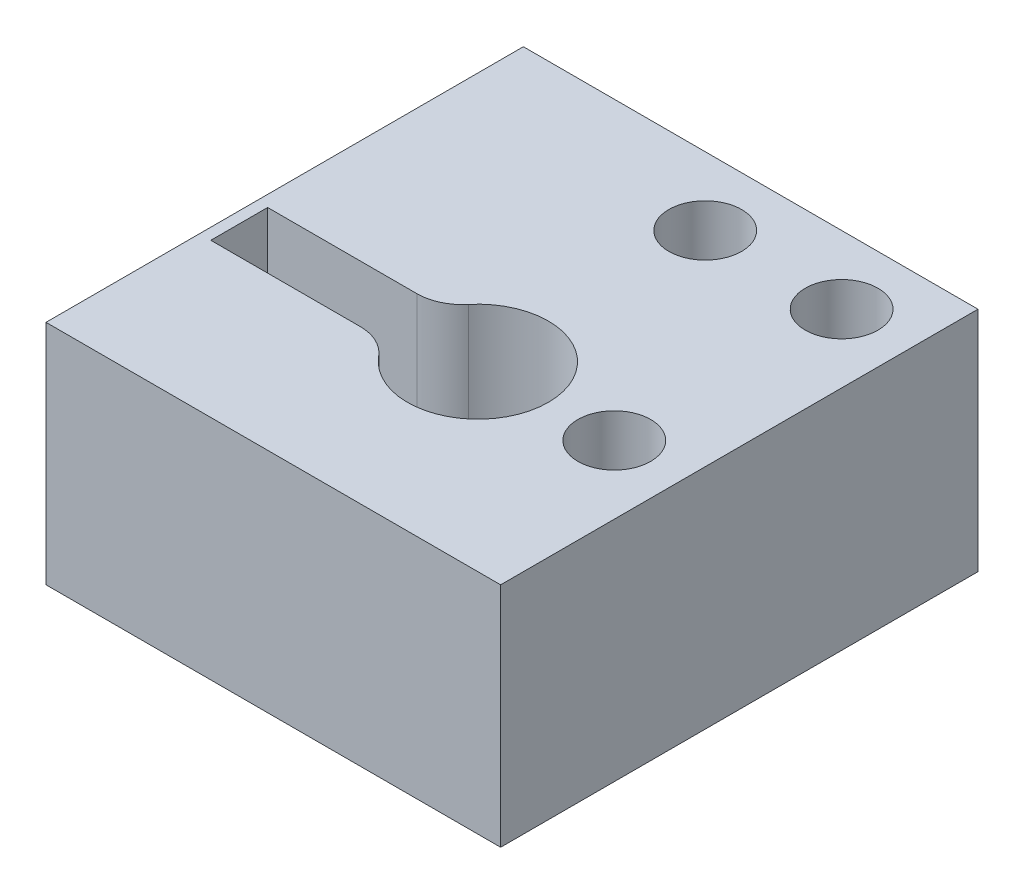
ISO-10303-21;
HEADER;
FILE_DESCRIPTION(('STEP AP214'),'2;1');
FILE_NAME('part.step','',(''),(''),'','','');
FILE_SCHEMA(('AUTOMOTIVE_DESIGN { 1 0 10303 214 1 1 1 1 }'));
ENDSEC;
DATA;
#1=APPLICATION_CONTEXT('core data for automotive mechanical design processes');
#2=APPLICATION_PROTOCOL_DEFINITION('international standard','automotive_design',2000,#1);
#3=PRODUCT_CONTEXT('',#1,'mechanical');
#4=PRODUCT('Part','Part','',(#3));
#5=PRODUCT_RELATED_PRODUCT_CATEGORY('part','',(#4));
#6=PRODUCT_DEFINITION_FORMATION('','',#4);
#7=PRODUCT_DEFINITION_CONTEXT('part definition',#1,'design');
#8=PRODUCT_DEFINITION('design','',#6,#7);
#9=PRODUCT_DEFINITION_SHAPE('','',#8);
#10=(LENGTH_UNIT() NAMED_UNIT(*) SI_UNIT(.MILLI.,.METRE.));
#11=(NAMED_UNIT(*) PLANE_ANGLE_UNIT() SI_UNIT($,.RADIAN.));
#12=(NAMED_UNIT(*) SI_UNIT($,.STERADIAN.) SOLID_ANGLE_UNIT());
#13=UNCERTAINTY_MEASURE_WITH_UNIT(LENGTH_MEASURE(1.E-05),#10,'distance_accuracy_value','');
#14=(GEOMETRIC_REPRESENTATION_CONTEXT(3) GLOBAL_UNCERTAINTY_ASSIGNED_CONTEXT((#13)) GLOBAL_UNIT_ASSIGNED_CONTEXT((#10,
#11,#12)) REPRESENTATION_CONTEXT('',''));
#15=CARTESIAN_POINT('',(0.,0.,0.));
#16=DIRECTION('',(0.,0.,1.));
#17=DIRECTION('',(1.,0.,0.));
#18=AXIS2_PLACEMENT_3D('',#15,#16,#17);
#19=CARTESIAN_POINT('',(10.,10.,10.5));
#20=DIRECTION('',(-1.,0.,0.));
#21=DIRECTION('',(0.,0.,1.));
#22=AXIS2_PLACEMENT_3D('',#19,#20,#21);
#23=PLANE('',#22);
#24=DIRECTION('',(0.,0.,-1.));
#25=VECTOR('',#24,1.);
#26=CARTESIAN_POINT('',(10.,0.,10.5));
#27=LINE('',#26,#25);
#28=CARTESIAN_POINT('',(10.,0.,10.5));
#29=VERTEX_POINT('',#28);
#30=CARTESIAN_POINT('',(10.,0.,-10.5));
#31=VERTEX_POINT('',#30);
#32=EDGE_CURVE('E191',#29,#31,#27,.T.);
#33=ORIENTED_EDGE('',*,*,#32,.T.);
#34=DIRECTION('',(0.,-1.,0.));
#35=VECTOR('',#34,1.);
#36=CARTESIAN_POINT('',(10.,10.,-10.5));
#37=LINE('',#36,#35);
#38=CARTESIAN_POINT('',(10.,10.,-10.5));
#39=VERTEX_POINT('',#38);
#40=EDGE_CURVE('E232',#39,#31,#37,.T.);
#41=ORIENTED_EDGE('',*,*,#40,.F.);
#42=DIRECTION('',(0.,0.,-1.));
#43=VECTOR('',#42,1.);
#44=CARTESIAN_POINT('',(10.,10.,10.5));
#45=LINE('',#44,#43);
#46=CARTESIAN_POINT('',(10.,10.,10.5));
#47=VERTEX_POINT('',#46);
#48=EDGE_CURVE('E197',#47,#39,#45,.T.);
#49=ORIENTED_EDGE('',*,*,#48,.F.);
#50=DIRECTION('',(0.,-1.,0.));
#51=VECTOR('',#50,1.);
#52=CARTESIAN_POINT('',(10.,10.,10.5));
#53=LINE('',#52,#51);
#54=EDGE_CURVE('E211',#47,#29,#53,.T.);
#55=ORIENTED_EDGE('',*,*,#54,.T.);
#56=EDGE_LOOP('',(#33,#41,#49,#55));
#57=FACE_BOUND('',#56,.T.);
#58=ADVANCED_FACE('F47',(#57),#23,.F.);
#59=CARTESIAN_POINT('',(-10.,10.,-10.5));
#60=DIRECTION('',(0.,0.,1.));
#61=DIRECTION('',(1.,0.,0.));
#62=AXIS2_PLACEMENT_3D('',#59,#60,#61);
#63=PLANE('',#62);
#64=DIRECTION('',(-1.,0.,0.));
#65=VECTOR('',#64,1.);
#66=CARTESIAN_POINT('',(-10.,0.,-10.5));
#67=LINE('',#66,#65);
#68=CARTESIAN_POINT('',(-10.,0.,-10.5));
#69=VERTEX_POINT('',#68);
#70=EDGE_CURVE('E215',#31,#69,#67,.T.);
#71=ORIENTED_EDGE('',*,*,#70,.T.);
#72=DIRECTION('',(0.,-1.,0.));
#73=VECTOR('',#72,1.);
#74=CARTESIAN_POINT('',(-10.,10.,-10.5));
#75=LINE('',#74,#73);
#76=CARTESIAN_POINT('',(-10.,10.,-10.5));
#77=VERTEX_POINT('',#76);
#78=EDGE_CURVE('E228',#77,#69,#75,.T.);
#79=ORIENTED_EDGE('',*,*,#78,.F.);
#80=DIRECTION('',(-1.,0.,0.));
#81=VECTOR('',#80,1.);
#82=CARTESIAN_POINT('',(-10.,10.,-10.5));
#83=LINE('',#82,#81);
#84=EDGE_CURVE('E201',#39,#77,#83,.T.);
#85=ORIENTED_EDGE('',*,*,#84,.F.);
#86=ORIENTED_EDGE('',*,*,#40,.T.);
#87=EDGE_LOOP('',(#71,#79,#85,#86));
#88=FACE_BOUND('',#87,.T.);
#89=ADVANCED_FACE('F278',(#88),#63,.F.);
#90=CARTESIAN_POINT('',(-10.,10.,10.5));
#91=DIRECTION('',(1.,0.,0.));
#92=DIRECTION('',(0.,0.,-1.));
#93=AXIS2_PLACEMENT_3D('',#90,#91,#92);
#94=PLANE('',#93);
#95=DIRECTION('',(0.,0.,1.));
#96=VECTOR('',#95,1.);
#97=CARTESIAN_POINT('',(-10.,0.,10.5));
#98=LINE('',#97,#96);
#99=CARTESIAN_POINT('',(-10.,0.,10.5));
#100=VERTEX_POINT('',#99);
#101=EDGE_CURVE('E218',#69,#100,#98,.T.);
#102=ORIENTED_EDGE('',*,*,#101,.T.);
#103=DIRECTION('',(0.,-1.,0.));
#104=VECTOR('',#103,1.);
#105=CARTESIAN_POINT('',(-10.,10.,10.5));
#106=LINE('',#105,#104);
#107=CARTESIAN_POINT('',(-10.,10.,10.5));
#108=VERTEX_POINT('',#107);
#109=EDGE_CURVE('E224',#108,#100,#106,.T.);
#110=ORIENTED_EDGE('',*,*,#109,.F.);
#111=DIRECTION('',(0.,0.,1.));
#112=VECTOR('',#111,1.);
#113=CARTESIAN_POINT('',(-10.,10.,10.5));
#114=LINE('',#113,#112);
#115=EDGE_CURVE('E205',#77,#108,#114,.T.);
#116=ORIENTED_EDGE('',*,*,#115,.F.);
#117=ORIENTED_EDGE('',*,*,#78,.T.);
#118=EDGE_LOOP('',(#102,#110,#116,#117));
#119=FACE_BOUND('',#118,.T.);
#120=ADVANCED_FACE('F283',(#119),#94,.F.);
#121=CARTESIAN_POINT('',(-10.,10.,10.5));
#122=DIRECTION('',(0.,0.,-1.));
#123=DIRECTION('',(-1.,0.,0.));
#124=AXIS2_PLACEMENT_3D('',#121,#122,#123);
#125=PLANE('',#124);
#126=DIRECTION('',(1.,0.,0.));
#127=VECTOR('',#126,1.);
#128=CARTESIAN_POINT('',(-10.,0.,10.5));
#129=LINE('',#128,#127);
#130=EDGE_CURVE('E202',#100,#29,#129,.T.);
#131=ORIENTED_EDGE('',*,*,#130,.T.);
#132=ORIENTED_EDGE('',*,*,#54,.F.);
#133=DIRECTION('',(1.,0.,0.));
#134=VECTOR('',#133,1.);
#135=CARTESIAN_POINT('',(-10.,10.,10.5));
#136=LINE('',#135,#134);
#137=EDGE_CURVE('E208',#108,#47,#136,.T.);
#138=ORIENTED_EDGE('',*,*,#137,.F.);
#139=ORIENTED_EDGE('',*,*,#109,.T.);
#140=EDGE_LOOP('',(#131,#132,#138,#139));
#141=FACE_BOUND('',#140,.T.);
#142=ADVANCED_FACE('F289',(#141),#125,.F.);
#143=CARTESIAN_POINT('',(0.,10.,0.));
#144=DIRECTION('',(0.,-1.,0.));
#145=DIRECTION('',(0.,0.,-1.));
#146=AXIS2_PLACEMENT_3D('',#143,#144,#145);
#147=PLANE('',#146);
#148=DIRECTION('',(1.,0.,0.));
#149=VECTOR('',#148,1.);
#150=CARTESIAN_POINT('',(-1.83681159050086,10.,3.75));
#151=LINE('',#150,#149);
#152=CARTESIAN_POINT('',(-9.5,10.,3.75));
#153=VERTEX_POINT('',#152);
#154=CARTESIAN_POINT('',(-2.93033077488397,10.,3.75));
#155=VERTEX_POINT('',#154);
#156=EDGE_CURVE('E126',#153,#155,#151,.T.);
#157=ORIENTED_EDGE('',*,*,#156,.F.);
#158=DIRECTION('',(0.,0.,-1.));
#159=VECTOR('',#158,1.);
#160=CARTESIAN_POINT('',(-9.5,10.,1.25));
#161=LINE('',#160,#159);
#162=CARTESIAN_POINT('',(-9.5,10.,1.25));
#163=VERTEX_POINT('',#162);
#164=EDGE_CURVE('E130',#153,#163,#161,.T.);
#165=ORIENTED_EDGE('',*,*,#164,.T.);
#166=DIRECTION('',(-1.,0.,0.));
#167=VECTOR('',#166,1.);
#168=CARTESIAN_POINT('',(-1.83681159050086,10.,1.25));
#169=LINE('',#168,#167);
#170=CARTESIAN_POINT('',(-2.93033077488397,10.,1.25));
#171=VERTEX_POINT('',#170);
#172=EDGE_CURVE('E70',#171,#163,#169,.T.);
#173=ORIENTED_EDGE('',*,*,#172,.F.);
#174=CARTESIAN_POINT('',(-2.93033077488397,10.,-0.75));
#175=DIRECTION('',(0.,-1.,0.));
#176=DIRECTION('',(0.,0.,-1.));
#177=AXIS2_PLACEMENT_3D('',#174,#175,#176);
#178=CIRCLE('',#177,2.);
#179=CARTESIAN_POINT('',(-1.38902458865496,10.,0.524509803921568));
#180=VERTEX_POINT('',#179);
#181=EDGE_CURVE('E243',#171,#180,#178,.F.);
#182=ORIENTED_EDGE('',*,*,#181,.T.);
#183=CARTESIAN_POINT('',(0.999999999999999,10.,2.5));
#184=DIRECTION('',(0.,1.,0.));
#185=DIRECTION('',(0.,0.,1.));
#186=AXIS2_PLACEMENT_3D('',#183,#184,#185);
#187=CIRCLE('',#186,3.1);
#188=CARTESIAN_POINT('',(-1.38902458865496,10.,4.47549019607843));
#189=VERTEX_POINT('',#188);
#190=EDGE_CURVE('E162',#189,#180,#187,.T.);
#191=ORIENTED_EDGE('',*,*,#190,.F.);
#192=CARTESIAN_POINT('',(-2.93033077488397,10.,5.75));
#193=DIRECTION('',(0.,-1.,0.));
#194=DIRECTION('',(0.,0.,-1.));
#195=AXIS2_PLACEMENT_3D('',#192,#193,#194);
#196=CIRCLE('',#195,2.);
#197=EDGE_CURVE('E132',#189,#155,#196,.F.);
#198=ORIENTED_EDGE('',*,*,#197,.T.);
#199=EDGE_LOOP('',(#157,#165,#173,#182,#191,#198));
#200=FACE_BOUND('',#199,.T.);
#201=CARTESIAN_POINT('',(0.999999999999999,10.,-7.5));
#202=DIRECTION('',(0.,1.,0.));
#203=DIRECTION('',(0.,0.,1.));
#204=AXIS2_PLACEMENT_3D('',#201,#202,#203);
#205=CIRCLE('',#204,1.6);
#206=CARTESIAN_POINT('',(0.999999999999999,10.,-5.9));
#207=VERTEX_POINT('',#206);
#208=EDGE_CURVE('E163',#207,#207,#205,.T.);
#209=ORIENTED_EDGE('',*,*,#208,.F.);
#210=EDGE_LOOP('',(#209));
#211=FACE_BOUND('',#210,.T.);
#212=CARTESIAN_POINT('',(7.,10.,-7.5));
#213=DIRECTION('',(0.,1.,0.));
#214=DIRECTION('',(0.,0.,1.));
#215=AXIS2_PLACEMENT_3D('',#212,#213,#214);
#216=CIRCLE('',#215,1.6);
#217=CARTESIAN_POINT('',(7.,10.,-5.9));
#218=VERTEX_POINT('',#217);
#219=EDGE_CURVE('E167',#218,#218,#216,.T.);
#220=ORIENTED_EDGE('',*,*,#219,.F.);
#221=EDGE_LOOP('',(#220));
#222=FACE_BOUND('',#221,.T.);
#223=CARTESIAN_POINT('',(7.,10.,2.5));
#224=DIRECTION('',(0.,1.,0.));
#225=DIRECTION('',(0.,0.,1.));
#226=AXIS2_PLACEMENT_3D('',#223,#224,#225);
#227=CIRCLE('',#226,1.6);
#228=CARTESIAN_POINT('',(7.,10.,4.1));
#229=VERTEX_POINT('',#228);
#230=EDGE_CURVE('E175',#229,#229,#227,.T.);
#231=ORIENTED_EDGE('',*,*,#230,.F.);
#232=EDGE_LOOP('',(#231));
#233=FACE_BOUND('',#232,.T.);
#234=ORIENTED_EDGE('',*,*,#115,.T.);
#235=ORIENTED_EDGE('',*,*,#137,.T.);
#236=ORIENTED_EDGE('',*,*,#48,.T.);
#237=ORIENTED_EDGE('',*,*,#84,.T.);
#238=EDGE_LOOP('',(#234,#235,#236,#237));
#239=FACE_BOUND('',#238,.T.);
#240=ADVANCED_FACE('F127',(#200,#211,#222,#233,#239),#147,.F.);
#241=CARTESIAN_POINT('',(0.,0.,0.));
#242=DIRECTION('',(0.,-1.,0.));
#243=DIRECTION('',(0.,0.,-1.));
#244=AXIS2_PLACEMENT_3D('',#241,#242,#243);
#245=PLANE('',#244);
#246=DIRECTION('',(0.,0.,-1.));
#247=VECTOR('',#246,1.);
#248=CARTESIAN_POINT('',(-9.5,0.,1.25));
#249=LINE('',#248,#247);
#250=CARTESIAN_POINT('',(-9.5,0.,3.75));
#251=VERTEX_POINT('',#250);
#252=CARTESIAN_POINT('',(-9.5,0.,1.25));
#253=VERTEX_POINT('',#252);
#254=EDGE_CURVE('E144',#251,#253,#249,.T.);
#255=ORIENTED_EDGE('',*,*,#254,.F.);
#256=DIRECTION('',(1.,0.,0.));
#257=VECTOR('',#256,1.);
#258=CARTESIAN_POINT('',(-1.83681159050086,0.,3.75));
#259=LINE('',#258,#257);
#260=CARTESIAN_POINT('',(-2.93033077488397,0.,3.75));
#261=VERTEX_POINT('',#260);
#262=EDGE_CURVE('E63',#251,#261,#259,.T.);
#263=ORIENTED_EDGE('',*,*,#262,.T.);
#264=CARTESIAN_POINT('',(-2.93033077488397,0.,5.75));
#265=DIRECTION('',(0.,-1.,0.));
#266=DIRECTION('',(0.,0.,-1.));
#267=AXIS2_PLACEMENT_3D('',#264,#265,#266);
#268=CIRCLE('',#267,2.);
#269=CARTESIAN_POINT('',(-1.38902458865496,0.,4.47549019607843));
#270=VERTEX_POINT('',#269);
#271=EDGE_CURVE('E56',#261,#270,#268,.T.);
#272=ORIENTED_EDGE('',*,*,#271,.T.);
#273=CARTESIAN_POINT('',(0.999999999999999,0.,2.5));
#274=DIRECTION('',(0.,1.,0.));
#275=DIRECTION('',(0.,0.,1.));
#276=AXIS2_PLACEMENT_3D('',#273,#274,#275);
#277=CIRCLE('',#276,3.1);
#278=CARTESIAN_POINT('',(-1.38902458865496,0.,0.524509803921568));
#279=VERTEX_POINT('',#278);
#280=EDGE_CURVE('E135',#270,#279,#277,.T.);
#281=ORIENTED_EDGE('',*,*,#280,.T.);
#282=CARTESIAN_POINT('',(-2.93033077488397,0.,-0.75));
#283=DIRECTION('',(0.,-1.,0.));
#284=DIRECTION('',(0.,0.,-1.));
#285=AXIS2_PLACEMENT_3D('',#282,#283,#284);
#286=CIRCLE('',#285,2.);
#287=CARTESIAN_POINT('',(-2.93033077488397,0.,1.25));
#288=VERTEX_POINT('',#287);
#289=EDGE_CURVE('E251',#279,#288,#286,.T.);
#290=ORIENTED_EDGE('',*,*,#289,.T.);
#291=DIRECTION('',(-1.,0.,0.));
#292=VECTOR('',#291,1.);
#293=CARTESIAN_POINT('',(-1.83681159050086,0.,1.25));
#294=LINE('',#293,#292);
#295=EDGE_CURVE('E185',#288,#253,#294,.T.);
#296=ORIENTED_EDGE('',*,*,#295,.T.);
#297=EDGE_LOOP('',(#255,#263,#272,#281,#290,#296));
#298=FACE_BOUND('',#297,.T.);
#299=CARTESIAN_POINT('',(0.999999999999999,0.,-7.5));
#300=DIRECTION('',(0.,1.,0.));
#301=DIRECTION('',(0.,0.,1.));
#302=AXIS2_PLACEMENT_3D('',#299,#300,#301);
#303=CIRCLE('',#302,1.6);
#304=CARTESIAN_POINT('',(0.999999999999999,0.,-5.9));
#305=VERTEX_POINT('',#304);
#306=EDGE_CURVE('E158',#305,#305,#303,.T.);
#307=ORIENTED_EDGE('',*,*,#306,.T.);
#308=EDGE_LOOP('',(#307));
#309=FACE_BOUND('',#308,.T.);
#310=CARTESIAN_POINT('',(7.,0.,-7.5));
#311=DIRECTION('',(0.,1.,0.));
#312=DIRECTION('',(0.,0.,1.));
#313=AXIS2_PLACEMENT_3D('',#310,#311,#312);
#314=CIRCLE('',#313,1.6);
#315=CARTESIAN_POINT('',(7.,0.,-5.9));
#316=VERTEX_POINT('',#315);
#317=EDGE_CURVE('E171',#316,#316,#314,.T.);
#318=ORIENTED_EDGE('',*,*,#317,.T.);
#319=EDGE_LOOP('',(#318));
#320=FACE_BOUND('',#319,.T.);
#321=CARTESIAN_POINT('',(7.,0.,2.5));
#322=DIRECTION('',(0.,1.,0.));
#323=DIRECTION('',(0.,0.,1.));
#324=AXIS2_PLACEMENT_3D('',#321,#322,#323);
#325=CIRCLE('',#324,1.6);
#326=CARTESIAN_POINT('',(7.,0.,4.1));
#327=VERTEX_POINT('',#326);
#328=EDGE_CURVE('E156',#327,#327,#325,.T.);
#329=ORIENTED_EDGE('',*,*,#328,.T.);
#330=EDGE_LOOP('',(#329));
#331=FACE_BOUND('',#330,.T.);
#332=ORIENTED_EDGE('',*,*,#130,.F.);
#333=ORIENTED_EDGE('',*,*,#101,.F.);
#334=ORIENTED_EDGE('',*,*,#70,.F.);
#335=ORIENTED_EDGE('',*,*,#32,.F.);
#336=EDGE_LOOP('',(#332,#333,#334,#335));
#337=FACE_BOUND('',#336,.T.);
#338=ADVANCED_FACE('F258',(#298,#309,#320,#331,#337),#245,.T.);
#339=CARTESIAN_POINT('',(0.999999999999999,0.,2.5));
#340=DIRECTION('',(0.,1.,0.));
#341=DIRECTION('',(0.,0.,1.));
#342=AXIS2_PLACEMENT_3D('',#339,#340,#341);
#343=CYLINDRICAL_SURFACE('',#342,3.1);
#344=ORIENTED_EDGE('',*,*,#280,.F.);
#345=DIRECTION('',(0.,1.,0.));
#346=VECTOR('',#345,1.);
#347=CARTESIAN_POINT('',(-1.38902458865496,0.,4.47549019607843));
#348=LINE('',#347,#346);
#349=EDGE_CURVE('E239',#270,#189,#348,.T.);
#350=ORIENTED_EDGE('',*,*,#349,.T.);
#351=ORIENTED_EDGE('',*,*,#190,.T.);
#352=DIRECTION('',(0.,1.,0.));
#353=VECTOR('',#352,1.);
#354=CARTESIAN_POINT('',(-1.38902458865496,0.,0.524509803921568));
#355=LINE('',#354,#353);
#356=EDGE_CURVE('E236',#180,#279,#355,.F.);
#357=ORIENTED_EDGE('',*,*,#356,.T.);
#358=EDGE_LOOP('',(#344,#350,#351,#357));
#359=FACE_BOUND('',#358,.T.);
#360=ADVANCED_FACE('F264',(#359),#343,.F.);
#361=CARTESIAN_POINT('',(-1.83681159050086,0.,3.75));
#362=DIRECTION('',(0.,0.,1.));
#363=DIRECTION('',(1.,0.,0.));
#364=AXIS2_PLACEMENT_3D('',#361,#362,#363);
#365=PLANE('',#364);
#366=ORIENTED_EDGE('',*,*,#262,.F.);
#367=DIRECTION('',(0.,1.,0.));
#368=VECTOR('',#367,1.);
#369=CARTESIAN_POINT('',(-9.5,0.,3.75));
#370=LINE('',#369,#368);
#371=EDGE_CURVE('E137',#251,#153,#370,.T.);
#372=ORIENTED_EDGE('',*,*,#371,.T.);
#373=ORIENTED_EDGE('',*,*,#156,.T.);
#374=DIRECTION('',(0.,1.,0.));
#375=VECTOR('',#374,1.);
#376=CARTESIAN_POINT('',(-2.93033077488397,0.,3.75));
#377=LINE('',#376,#375);
#378=EDGE_CURVE('E248',#155,#261,#377,.F.);
#379=ORIENTED_EDGE('',*,*,#378,.T.);
#380=EDGE_LOOP('',(#366,#372,#373,#379));
#381=FACE_BOUND('',#380,.T.);
#382=ADVANCED_FACE('F138',(#381),#365,.F.);
#383=CARTESIAN_POINT('',(-1.83681159050086,0.,1.25));
#384=DIRECTION('',(0.,0.,-1.));
#385=DIRECTION('',(-1.,0.,0.));
#386=AXIS2_PLACEMENT_3D('',#383,#384,#385);
#387=PLANE('',#386);
#388=ORIENTED_EDGE('',*,*,#172,.T.);
#389=DIRECTION('',(0.,1.,0.));
#390=VECTOR('',#389,1.);
#391=CARTESIAN_POINT('',(-9.5,0.,1.25));
#392=LINE('',#391,#390);
#393=EDGE_CURVE('E143',#253,#163,#392,.T.);
#394=ORIENTED_EDGE('',*,*,#393,.F.);
#395=ORIENTED_EDGE('',*,*,#295,.F.);
#396=DIRECTION('',(0.,1.,0.));
#397=VECTOR('',#396,1.);
#398=CARTESIAN_POINT('',(-2.93033077488397,0.,1.25));
#399=LINE('',#398,#397);
#400=EDGE_CURVE('E11',#288,#171,#399,.T.);
#401=ORIENTED_EDGE('',*,*,#400,.T.);
#402=EDGE_LOOP('',(#388,#394,#395,#401));
#403=FACE_BOUND('',#402,.T.);
#404=ADVANCED_FACE('F268',(#403),#387,.F.);
#405=CARTESIAN_POINT('',(-2.93033077488397,0.,5.75));
#406=DIRECTION('',(0.,1.,0.));
#407=DIRECTION('',(0.,0.,1.));
#408=AXIS2_PLACEMENT_3D('',#405,#406,#407);
#409=CYLINDRICAL_SURFACE('',#408,2.);
#410=ORIENTED_EDGE('',*,*,#271,.F.);
#411=ORIENTED_EDGE('',*,*,#378,.F.);
#412=ORIENTED_EDGE('',*,*,#197,.F.);
#413=ORIENTED_EDGE('',*,*,#349,.F.);
#414=EDGE_LOOP('',(#410,#411,#412,#413));
#415=FACE_BOUND('',#414,.T.);
#416=ADVANCED_FACE('F266',(#415),#409,.T.);
#417=CARTESIAN_POINT('',(-2.93033077488397,0.,-0.75));
#418=DIRECTION('',(0.,1.,0.));
#419=DIRECTION('',(0.,0.,1.));
#420=AXIS2_PLACEMENT_3D('',#417,#418,#419);
#421=CYLINDRICAL_SURFACE('',#420,2.);
#422=ORIENTED_EDGE('',*,*,#289,.F.);
#423=ORIENTED_EDGE('',*,*,#356,.F.);
#424=ORIENTED_EDGE('',*,*,#181,.F.);
#425=ORIENTED_EDGE('',*,*,#400,.F.);
#426=EDGE_LOOP('',(#422,#423,#424,#425));
#427=FACE_BOUND('',#426,.T.);
#428=ADVANCED_FACE('F49',(#427),#421,.T.);
#429=CARTESIAN_POINT('',(7.,0.,2.5));
#430=DIRECTION('',(0.,1.,0.));
#431=DIRECTION('',(0.,0.,1.));
#432=AXIS2_PLACEMENT_3D('',#429,#430,#431);
#433=CYLINDRICAL_SURFACE('',#432,1.6);
#434=ORIENTED_EDGE('',*,*,#328,.F.);
#435=EDGE_LOOP('',(#434));
#436=FACE_BOUND('',#435,.T.);
#437=ORIENTED_EDGE('',*,*,#230,.T.);
#438=EDGE_LOOP('',(#437));
#439=FACE_BOUND('',#438,.T.);
#440=ADVANCED_FACE('F273',(#436,#439),#433,.F.);
#441=CARTESIAN_POINT('',(7.,0.,-7.5));
#442=DIRECTION('',(0.,1.,0.));
#443=DIRECTION('',(0.,0.,1.));
#444=AXIS2_PLACEMENT_3D('',#441,#442,#443);
#445=CYLINDRICAL_SURFACE('',#444,1.6);
#446=ORIENTED_EDGE('',*,*,#317,.F.);
#447=EDGE_LOOP('',(#446));
#448=FACE_BOUND('',#447,.T.);
#449=ORIENTED_EDGE('',*,*,#219,.T.);
#450=EDGE_LOOP('',(#449));
#451=FACE_BOUND('',#450,.T.);
#452=ADVANCED_FACE('F304',(#448,#451),#445,.F.);
#453=CARTESIAN_POINT('',(0.999999999999999,0.,-7.5));
#454=DIRECTION('',(0.,1.,0.));
#455=DIRECTION('',(0.,0.,1.));
#456=AXIS2_PLACEMENT_3D('',#453,#454,#455);
#457=CYLINDRICAL_SURFACE('',#456,1.6);
#458=ORIENTED_EDGE('',*,*,#306,.F.);
#459=EDGE_LOOP('',(#458));
#460=FACE_BOUND('',#459,.T.);
#461=ORIENTED_EDGE('',*,*,#208,.T.);
#462=EDGE_LOOP('',(#461));
#463=FACE_BOUND('',#462,.T.);
#464=ADVANCED_FACE('F308',(#460,#463),#457,.F.);
#465=CARTESIAN_POINT('',(-9.5,0.,1.25));
#466=DIRECTION('',(1.,0.,0.));
#467=DIRECTION('',(0.,0.,-1.));
#468=AXIS2_PLACEMENT_3D('',#465,#466,#467);
#469=PLANE('',#468);
#470=ORIENTED_EDGE('',*,*,#164,.F.);
#471=ORIENTED_EDGE('',*,*,#371,.F.);
#472=ORIENTED_EDGE('',*,*,#254,.T.);
#473=ORIENTED_EDGE('',*,*,#393,.T.);
#474=EDGE_LOOP('',(#470,#471,#472,#473));
#475=FACE_BOUND('',#474,.T.);
#476=ADVANCED_FACE('F146',(#475),#469,.T.);
#477=CLOSED_SHELL('',(#58,#89,#120,#142,#240,#338,#360,#382,#404,#416,#428,#440,#452,#464,#476));
#478=MANIFOLD_SOLID_BREP('B2',#477);
#479=ADVANCED_BREP_SHAPE_REPRESENTATION('',(#18,#478),#14);
#480=SHAPE_DEFINITION_REPRESENTATION(#9,#479);
ENDSEC;
END-ISO-10303-21;
